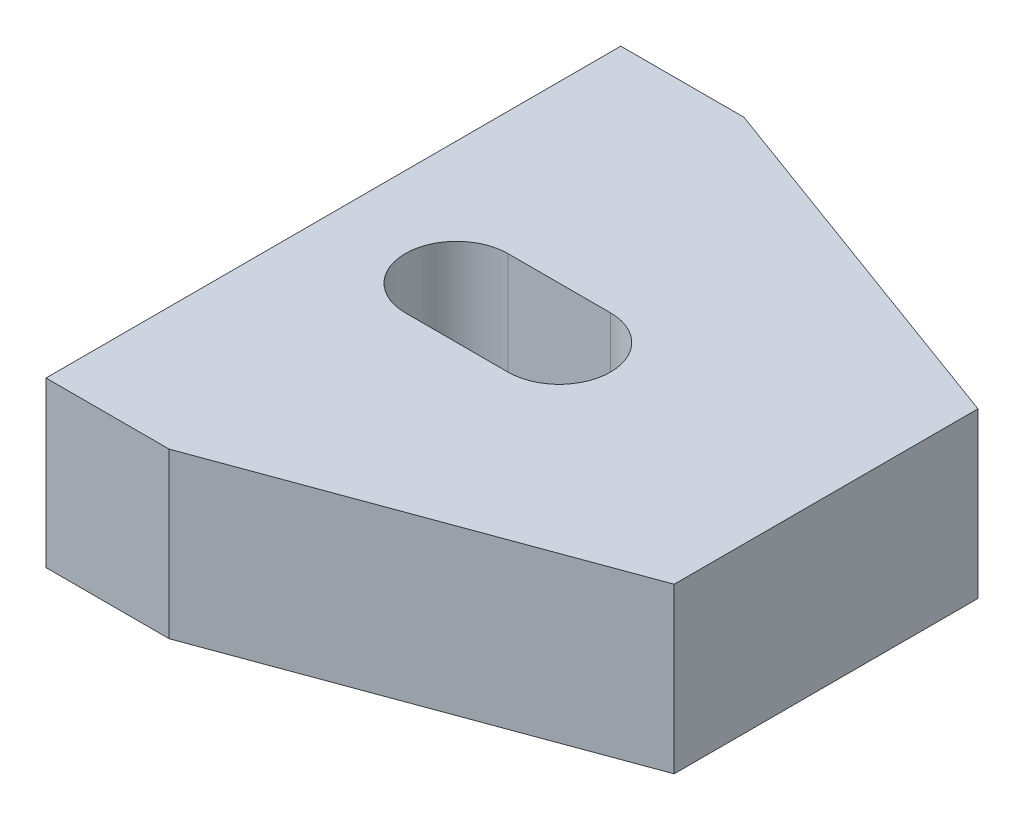
ISO-10303-21;
HEADER;
FILE_DESCRIPTION(('STEP AP214'),'2;1');
FILE_NAME('part.step','',(''),(''),'','','');
FILE_SCHEMA(('AUTOMOTIVE_DESIGN { 1 0 10303 214 1 1 1 1 }'));
ENDSEC;
DATA;
#1=APPLICATION_CONTEXT('core data for automotive mechanical design processes');
#2=APPLICATION_PROTOCOL_DEFINITION('international standard','automotive_design',2000,#1);
#3=PRODUCT_CONTEXT('',#1,'mechanical');
#4=PRODUCT('Part','Part','',(#3));
#5=PRODUCT_RELATED_PRODUCT_CATEGORY('part','',(#4));
#6=PRODUCT_DEFINITION_FORMATION('','',#4);
#7=PRODUCT_DEFINITION_CONTEXT('part definition',#1,'design');
#8=PRODUCT_DEFINITION('design','',#6,#7);
#9=PRODUCT_DEFINITION_SHAPE('','',#8);
#10=(LENGTH_UNIT() NAMED_UNIT(*) SI_UNIT(.MILLI.,.METRE.));
#11=(NAMED_UNIT(*) PLANE_ANGLE_UNIT() SI_UNIT($,.RADIAN.));
#12=(NAMED_UNIT(*) SI_UNIT($,.STERADIAN.) SOLID_ANGLE_UNIT());
#13=UNCERTAINTY_MEASURE_WITH_UNIT(LENGTH_MEASURE(1.E-05),#10,'distance_accuracy_value','');
#14=(GEOMETRIC_REPRESENTATION_CONTEXT(3) GLOBAL_UNCERTAINTY_ASSIGNED_CONTEXT((#13)) GLOBAL_UNIT_ASSIGNED_CONTEXT((#10,
#11,#12)) REPRESENTATION_CONTEXT('',''));
#15=CARTESIAN_POINT('',(0.,0.,0.));
#16=DIRECTION('',(0.,0.,1.));
#17=DIRECTION('',(1.,0.,0.));
#18=AXIS2_PLACEMENT_3D('',#15,#16,#17);
#19=CARTESIAN_POINT('',(0.,5.08,0.));
#20=DIRECTION('',(0.,1.,0.));
#21=DIRECTION('',(0.,0.,1.));
#22=AXIS2_PLACEMENT_3D('',#19,#20,#21);
#23=PLANE('',#22);
#24=DIRECTION('',(-1.,0.,0.));
#25=VECTOR('',#24,1.);
#26=CARTESIAN_POINT('',(-11.43,5.08,-8.89));
#27=LINE('',#26,#25);
#28=CARTESIAN_POINT('',(-11.43,5.08,-8.89));
#29=VERTEX_POINT('',#28);
#30=CARTESIAN_POINT('',(-15.24,5.08,-8.89));
#31=VERTEX_POINT('',#30);
#32=EDGE_CURVE('E146',#29,#31,#27,.T.);
#33=ORIENTED_EDGE('',*,*,#32,.T.);
#34=DIRECTION('',(0.,0.,1.));
#35=VECTOR('',#34,1.);
#36=CARTESIAN_POINT('',(-15.24,5.08,-8.89));
#37=LINE('',#36,#35);
#38=CARTESIAN_POINT('',(-15.24,5.08,8.89));
#39=VERTEX_POINT('',#38);
#40=EDGE_CURVE('E149',#31,#39,#37,.T.);
#41=ORIENTED_EDGE('',*,*,#40,.T.);
#42=DIRECTION('',(1.,0.,0.));
#43=VECTOR('',#42,1.);
#44=CARTESIAN_POINT('',(-15.24,5.08,8.89));
#45=LINE('',#44,#43);
#46=CARTESIAN_POINT('',(-11.43,5.08,8.89));
#47=VERTEX_POINT('',#46);
#48=EDGE_CURVE('E152',#39,#47,#45,.T.);
#49=ORIENTED_EDGE('',*,*,#48,.T.);
#50=DIRECTION('',(0.938876315886609,0.,-0.344254649158423));
#51=VECTOR('',#50,1.);
#52=CARTESIAN_POINT('',(-11.43,5.08,8.89));
#53=LINE('',#52,#51);
#54=CARTESIAN_POINT('',(0.,5.08,4.699));
#55=VERTEX_POINT('',#54);
#56=EDGE_CURVE('E154',#47,#55,#53,.T.);
#57=ORIENTED_EDGE('',*,*,#56,.T.);
#58=DIRECTION('',(0.,0.,-1.));
#59=VECTOR('',#58,1.);
#60=CARTESIAN_POINT('',(0.,5.08,4.699));
#61=LINE('',#60,#59);
#62=CARTESIAN_POINT('',(0.,5.08,-4.699));
#63=VERTEX_POINT('',#62);
#64=EDGE_CURVE('E156',#55,#63,#61,.T.);
#65=ORIENTED_EDGE('',*,*,#64,.T.);
#66=DIRECTION('',(-0.938876315886609,0.,-0.344254649158423));
#67=VECTOR('',#66,1.);
#68=CARTESIAN_POINT('',(0.,5.08,-4.699));
#69=LINE('',#68,#67);
#70=EDGE_CURVE('E158',#63,#29,#69,.T.);
#71=ORIENTED_EDGE('',*,*,#70,.T.);
#72=EDGE_LOOP('',(#33,#41,#49,#57,#65,#71));
#73=FACE_BOUND('',#72,.T.);
#74=DIRECTION('',(1.,0.,0.));
#75=VECTOR('',#74,1.);
#76=CARTESIAN_POINT('',(-11.43,5.08,1.5875));
#77=LINE('',#76,#75);
#78=CARTESIAN_POINT('',(-11.43,5.08,1.5875));
#79=VERTEX_POINT('',#78);
#80=CARTESIAN_POINT('',(-8.255,5.08,1.5875));
#81=VERTEX_POINT('',#80);
#82=EDGE_CURVE('E118',#79,#81,#77,.T.);
#83=ORIENTED_EDGE('',*,*,#82,.F.);
#84=CARTESIAN_POINT('',(-11.43,5.08,0.));
#85=DIRECTION('',(0.,1.,0.));
#86=DIRECTION('',(0.,0.,1.));
#87=AXIS2_PLACEMENT_3D('',#84,#85,#86);
#88=CIRCLE('',#87,1.5875);
#89=CARTESIAN_POINT('',(-11.43,5.08,-1.5875));
#90=VERTEX_POINT('',#89);
#91=EDGE_CURVE('E110',#90,#79,#88,.T.);
#92=ORIENTED_EDGE('',*,*,#91,.F.);
#93=DIRECTION('',(-1.,0.,0.));
#94=VECTOR('',#93,1.);
#95=CARTESIAN_POINT('',(-11.43,5.08,-1.5875));
#96=LINE('',#95,#94);
#97=CARTESIAN_POINT('',(-8.255,5.08,-1.5875));
#98=VERTEX_POINT('',#97);
#99=EDGE_CURVE('E132',#98,#90,#96,.T.);
#100=ORIENTED_EDGE('',*,*,#99,.F.);
#101=CARTESIAN_POINT('',(-8.255,5.08,0.));
#102=DIRECTION('',(0.,1.,0.));
#103=DIRECTION('',(0.,0.,1.));
#104=AXIS2_PLACEMENT_3D('',#101,#102,#103);
#105=CIRCLE('',#104,1.5875);
#106=EDGE_CURVE('E130',#81,#98,#105,.T.);
#107=ORIENTED_EDGE('',*,*,#106,.F.);
#108=EDGE_LOOP('',(#83,#92,#100,#107));
#109=FACE_BOUND('',#108,.T.);
#110=ADVANCED_FACE('F33',(#73,#109),#23,.T.);
#111=CARTESIAN_POINT('',(0.,0.,0.));
#112=DIRECTION('',(0.,1.,0.));
#113=DIRECTION('',(0.,0.,1.));
#114=AXIS2_PLACEMENT_3D('',#111,#112,#113);
#115=PLANE('',#114);
#116=DIRECTION('',(-1.,0.,0.));
#117=VECTOR('',#116,1.);
#118=CARTESIAN_POINT('',(-11.43,0.,-8.89));
#119=LINE('',#118,#117);
#120=CARTESIAN_POINT('',(-11.43,0.,-8.89));
#121=VERTEX_POINT('',#120);
#122=CARTESIAN_POINT('',(-15.24,0.,-8.89));
#123=VERTEX_POINT('',#122);
#124=EDGE_CURVE('E126',#121,#123,#119,.T.);
#125=ORIENTED_EDGE('',*,*,#124,.F.);
#126=DIRECTION('',(-0.938876315886609,0.,-0.344254649158423));
#127=VECTOR('',#126,1.);
#128=CARTESIAN_POINT('',(0.,0.,-4.699));
#129=LINE('',#128,#127);
#130=CARTESIAN_POINT('',(0.,0.,-4.699));
#131=VERTEX_POINT('',#130);
#132=EDGE_CURVE('E150',#131,#121,#129,.T.);
#133=ORIENTED_EDGE('',*,*,#132,.F.);
#134=DIRECTION('',(0.,0.,-1.));
#135=VECTOR('',#134,1.);
#136=CARTESIAN_POINT('',(0.,0.,4.699));
#137=LINE('',#136,#135);
#138=CARTESIAN_POINT('',(0.,0.,4.699));
#139=VERTEX_POINT('',#138);
#140=EDGE_CURVE('E169',#139,#131,#137,.T.);
#141=ORIENTED_EDGE('',*,*,#140,.F.);
#142=DIRECTION('',(0.938876315886609,0.,-0.344254649158423));
#143=VECTOR('',#142,1.);
#144=CARTESIAN_POINT('',(-11.43,0.,8.89));
#145=LINE('',#144,#143);
#146=CARTESIAN_POINT('',(-11.43,0.,8.89));
#147=VERTEX_POINT('',#146);
#148=EDGE_CURVE('E167',#147,#139,#145,.T.);
#149=ORIENTED_EDGE('',*,*,#148,.F.);
#150=DIRECTION('',(1.,0.,0.));
#151=VECTOR('',#150,1.);
#152=CARTESIAN_POINT('',(-15.24,0.,8.89));
#153=LINE('',#152,#151);
#154=CARTESIAN_POINT('',(-15.24,0.,8.89));
#155=VERTEX_POINT('',#154);
#156=EDGE_CURVE('E165',#155,#147,#153,.T.);
#157=ORIENTED_EDGE('',*,*,#156,.F.);
#158=DIRECTION('',(0.,0.,1.));
#159=VECTOR('',#158,1.);
#160=CARTESIAN_POINT('',(-15.24,0.,-8.89));
#161=LINE('',#160,#159);
#162=EDGE_CURVE('E163',#123,#155,#161,.T.);
#163=ORIENTED_EDGE('',*,*,#162,.F.);
#164=EDGE_LOOP('',(#125,#133,#141,#149,#157,#163));
#165=FACE_BOUND('',#164,.T.);
#166=CARTESIAN_POINT('',(-11.43,0.,0.));
#167=DIRECTION('',(0.,1.,0.));
#168=DIRECTION('',(0.,0.,1.));
#169=AXIS2_PLACEMENT_3D('',#166,#167,#168);
#170=CIRCLE('',#169,1.5875);
#171=CARTESIAN_POINT('',(-11.43,0.,-1.5875));
#172=VERTEX_POINT('',#171);
#173=CARTESIAN_POINT('',(-11.43,0.,1.5875));
#174=VERTEX_POINT('',#173);
#175=EDGE_CURVE('E56',#172,#174,#170,.T.);
#176=ORIENTED_EDGE('',*,*,#175,.T.);
#177=DIRECTION('',(1.,0.,0.));
#178=VECTOR('',#177,1.);
#179=CARTESIAN_POINT('',(-11.43,0.,1.5875));
#180=LINE('',#179,#178);
#181=CARTESIAN_POINT('',(-8.255,0.,1.5875));
#182=VERTEX_POINT('',#181);
#183=EDGE_CURVE('E125',#174,#182,#180,.T.);
#184=ORIENTED_EDGE('',*,*,#183,.T.);
#185=CARTESIAN_POINT('',(-8.255,0.,0.));
#186=DIRECTION('',(0.,1.,0.));
#187=DIRECTION('',(0.,0.,1.));
#188=AXIS2_PLACEMENT_3D('',#185,#186,#187);
#189=CIRCLE('',#188,1.5875);
#190=CARTESIAN_POINT('',(-8.255,0.,-1.5875));
#191=VERTEX_POINT('',#190);
#192=EDGE_CURVE('E138',#182,#191,#189,.T.);
#193=ORIENTED_EDGE('',*,*,#192,.T.);
#194=DIRECTION('',(-1.,0.,0.));
#195=VECTOR('',#194,1.);
#196=CARTESIAN_POINT('',(-11.43,0.,-1.5875));
#197=LINE('',#196,#195);
#198=EDGE_CURVE('E119',#191,#172,#197,.T.);
#199=ORIENTED_EDGE('',*,*,#198,.T.);
#200=EDGE_LOOP('',(#176,#184,#193,#199));
#201=FACE_BOUND('',#200,.T.);
#202=ADVANCED_FACE('F193',(#165,#201),#115,.F.);
#203=CARTESIAN_POINT('',(-11.43,5.08,-8.89));
#204=DIRECTION('',(0.,0.,1.));
#205=DIRECTION('',(1.,0.,0.));
#206=AXIS2_PLACEMENT_3D('',#203,#204,#205);
#207=PLANE('',#206);
#208=ORIENTED_EDGE('',*,*,#124,.T.);
#209=DIRECTION('',(0.,-1.,0.));
#210=VECTOR('',#209,1.);
#211=CARTESIAN_POINT('',(-15.24,5.08,-8.89));
#212=LINE('',#211,#210);
#213=EDGE_CURVE('E11',#31,#123,#212,.T.);
#214=ORIENTED_EDGE('',*,*,#213,.F.);
#215=ORIENTED_EDGE('',*,*,#32,.F.);
#216=DIRECTION('',(0.,-1.,0.));
#217=VECTOR('',#216,1.);
#218=CARTESIAN_POINT('',(-11.43,5.08,-8.89));
#219=LINE('',#218,#217);
#220=EDGE_CURVE('E160',#29,#121,#219,.T.);
#221=ORIENTED_EDGE('',*,*,#220,.T.);
#222=EDGE_LOOP('',(#208,#214,#215,#221));
#223=FACE_BOUND('',#222,.T.);
#224=ADVANCED_FACE('F35',(#223),#207,.F.);
#225=CARTESIAN_POINT('',(-15.24,5.08,-8.89));
#226=DIRECTION('',(1.,0.,0.));
#227=DIRECTION('',(0.,0.,-1.));
#228=AXIS2_PLACEMENT_3D('',#225,#226,#227);
#229=PLANE('',#228);
#230=ORIENTED_EDGE('',*,*,#162,.T.);
#231=DIRECTION('',(0.,-1.,0.));
#232=VECTOR('',#231,1.);
#233=CARTESIAN_POINT('',(-15.24,5.08,8.89));
#234=LINE('',#233,#232);
#235=EDGE_CURVE('E41',#39,#155,#234,.T.);
#236=ORIENTED_EDGE('',*,*,#235,.F.);
#237=ORIENTED_EDGE('',*,*,#40,.F.);
#238=ORIENTED_EDGE('',*,*,#213,.T.);
#239=EDGE_LOOP('',(#230,#236,#237,#238));
#240=FACE_BOUND('',#239,.T.);
#241=ADVANCED_FACE('F210',(#240),#229,.F.);
#242=CARTESIAN_POINT('',(-15.24,5.08,8.89));
#243=DIRECTION('',(0.,0.,-1.));
#244=DIRECTION('',(-1.,0.,0.));
#245=AXIS2_PLACEMENT_3D('',#242,#243,#244);
#246=PLANE('',#245);
#247=ORIENTED_EDGE('',*,*,#156,.T.);
#248=DIRECTION('',(0.,-1.,0.));
#249=VECTOR('',#248,1.);
#250=CARTESIAN_POINT('',(-11.43,5.08,8.89));
#251=LINE('',#250,#249);
#252=EDGE_CURVE('E180',#47,#147,#251,.T.);
#253=ORIENTED_EDGE('',*,*,#252,.F.);
#254=ORIENTED_EDGE('',*,*,#48,.F.);
#255=ORIENTED_EDGE('',*,*,#235,.T.);
#256=EDGE_LOOP('',(#247,#253,#254,#255));
#257=FACE_BOUND('',#256,.T.);
#258=ADVANCED_FACE('F187',(#257),#246,.F.);
#259=CARTESIAN_POINT('',(-11.43,5.08,8.89));
#260=DIRECTION('',(-0.344254649158423,0.,-0.938876315886609));
#261=DIRECTION('',(-0.938876315886609,0.,0.344254649158423));
#262=AXIS2_PLACEMENT_3D('',#259,#260,#261);
#263=PLANE('',#262);
#264=ORIENTED_EDGE('',*,*,#148,.T.);
#265=DIRECTION('',(0.,-1.,0.));
#266=VECTOR('',#265,1.);
#267=CARTESIAN_POINT('',(0.,5.08,4.699));
#268=LINE('',#267,#266);
#269=EDGE_CURVE('E177',#55,#139,#268,.T.);
#270=ORIENTED_EDGE('',*,*,#269,.F.);
#271=ORIENTED_EDGE('',*,*,#56,.F.);
#272=ORIENTED_EDGE('',*,*,#252,.T.);
#273=EDGE_LOOP('',(#264,#270,#271,#272));
#274=FACE_BOUND('',#273,.T.);
#275=ADVANCED_FACE('F199',(#274),#263,.F.);
#276=CARTESIAN_POINT('',(0.,5.08,4.699));
#277=DIRECTION('',(-1.,0.,0.));
#278=DIRECTION('',(0.,0.,1.));
#279=AXIS2_PLACEMENT_3D('',#276,#277,#278);
#280=PLANE('',#279);
#281=ORIENTED_EDGE('',*,*,#140,.T.);
#282=DIRECTION('',(0.,-1.,0.));
#283=VECTOR('',#282,1.);
#284=CARTESIAN_POINT('',(0.,5.08,-4.699));
#285=LINE('',#284,#283);
#286=EDGE_CURVE('E174',#63,#131,#285,.T.);
#287=ORIENTED_EDGE('',*,*,#286,.F.);
#288=ORIENTED_EDGE('',*,*,#64,.F.);
#289=ORIENTED_EDGE('',*,*,#269,.T.);
#290=EDGE_LOOP('',(#281,#287,#288,#289));
#291=FACE_BOUND('',#290,.T.);
#292=ADVANCED_FACE('F203',(#291),#280,.F.);
#293=CARTESIAN_POINT('',(0.,5.08,-4.699));
#294=DIRECTION('',(-0.344254649158423,0.,0.938876315886609));
#295=DIRECTION('',(0.938876315886609,0.,0.344254649158423));
#296=AXIS2_PLACEMENT_3D('',#293,#294,#295);
#297=PLANE('',#296);
#298=ORIENTED_EDGE('',*,*,#132,.T.);
#299=ORIENTED_EDGE('',*,*,#220,.F.);
#300=ORIENTED_EDGE('',*,*,#70,.F.);
#301=ORIENTED_EDGE('',*,*,#286,.T.);
#302=EDGE_LOOP('',(#298,#299,#300,#301));
#303=FACE_BOUND('',#302,.T.);
#304=ADVANCED_FACE('F213',(#303),#297,.F.);
#305=CARTESIAN_POINT('',(-11.43,5.08,0.));
#306=DIRECTION('',(0.,-1.,0.));
#307=DIRECTION('',(0.,0.,-1.));
#308=AXIS2_PLACEMENT_3D('',#305,#306,#307);
#309=CYLINDRICAL_SURFACE('',#308,1.5875);
#310=ORIENTED_EDGE('',*,*,#175,.F.);
#311=DIRECTION('',(0.,-1.,0.));
#312=VECTOR('',#311,1.);
#313=CARTESIAN_POINT('',(-11.43,5.08,-1.5875));
#314=LINE('',#313,#312);
#315=EDGE_CURVE('E114',#90,#172,#314,.T.);
#316=ORIENTED_EDGE('',*,*,#315,.F.);
#317=ORIENTED_EDGE('',*,*,#91,.T.);
#318=DIRECTION('',(0.,-1.,0.));
#319=VECTOR('',#318,1.);
#320=CARTESIAN_POINT('',(-11.43,5.08,1.5875));
#321=LINE('',#320,#319);
#322=EDGE_CURVE('E113',#79,#174,#321,.T.);
#323=ORIENTED_EDGE('',*,*,#322,.T.);
#324=EDGE_LOOP('',(#310,#316,#317,#323));
#325=FACE_BOUND('',#324,.T.);
#326=ADVANCED_FACE('F112',(#325),#309,.F.);
#327=CARTESIAN_POINT('',(-11.43,5.08,1.5875));
#328=DIRECTION('',(0.,0.,-1.));
#329=DIRECTION('',(-1.,0.,0.));
#330=AXIS2_PLACEMENT_3D('',#327,#328,#329);
#331=PLANE('',#330);
#332=ORIENTED_EDGE('',*,*,#183,.F.);
#333=ORIENTED_EDGE('',*,*,#322,.F.);
#334=ORIENTED_EDGE('',*,*,#82,.T.);
#335=DIRECTION('',(0.,-1.,0.));
#336=VECTOR('',#335,1.);
#337=CARTESIAN_POINT('',(-8.255,5.08,1.5875));
#338=LINE('',#337,#336);
#339=EDGE_CURVE('E127',#81,#182,#338,.T.);
#340=ORIENTED_EDGE('',*,*,#339,.T.);
#341=EDGE_LOOP('',(#332,#333,#334,#340));
#342=FACE_BOUND('',#341,.T.);
#343=ADVANCED_FACE('F122',(#342),#331,.T.);
#344=CARTESIAN_POINT('',(-8.255,5.08,0.));
#345=DIRECTION('',(0.,-1.,0.));
#346=DIRECTION('',(0.,0.,-1.));
#347=AXIS2_PLACEMENT_3D('',#344,#345,#346);
#348=CYLINDRICAL_SURFACE('',#347,1.5875);
#349=ORIENTED_EDGE('',*,*,#192,.F.);
#350=ORIENTED_EDGE('',*,*,#339,.F.);
#351=ORIENTED_EDGE('',*,*,#106,.T.);
#352=DIRECTION('',(0.,-1.,0.));
#353=VECTOR('',#352,1.);
#354=CARTESIAN_POINT('',(-8.255,5.08,-1.5875));
#355=LINE('',#354,#353);
#356=EDGE_CURVE('E48',#98,#191,#355,.T.);
#357=ORIENTED_EDGE('',*,*,#356,.T.);
#358=EDGE_LOOP('',(#349,#350,#351,#357));
#359=FACE_BOUND('',#358,.T.);
#360=ADVANCED_FACE('F231',(#359),#348,.F.);
#361=CARTESIAN_POINT('',(-11.43,5.08,-1.5875));
#362=DIRECTION('',(0.,0.,1.));
#363=DIRECTION('',(1.,0.,0.));
#364=AXIS2_PLACEMENT_3D('',#361,#362,#363);
#365=PLANE('',#364);
#366=ORIENTED_EDGE('',*,*,#198,.F.);
#367=ORIENTED_EDGE('',*,*,#356,.F.);
#368=ORIENTED_EDGE('',*,*,#99,.T.);
#369=ORIENTED_EDGE('',*,*,#315,.T.);
#370=EDGE_LOOP('',(#366,#367,#368,#369));
#371=FACE_BOUND('',#370,.T.);
#372=ADVANCED_FACE('F234',(#371),#365,.T.);
#373=CLOSED_SHELL('',(#110,#202,#224,#241,#258,#275,#292,#304,#326,#343,#360,#372));
#374=MANIFOLD_SOLID_BREP('B2',#373);
#375=ADVANCED_BREP_SHAPE_REPRESENTATION('',(#18,#374),#14);
#376=SHAPE_DEFINITION_REPRESENTATION(#9,#375);
ENDSEC;
END-ISO-10303-21;
